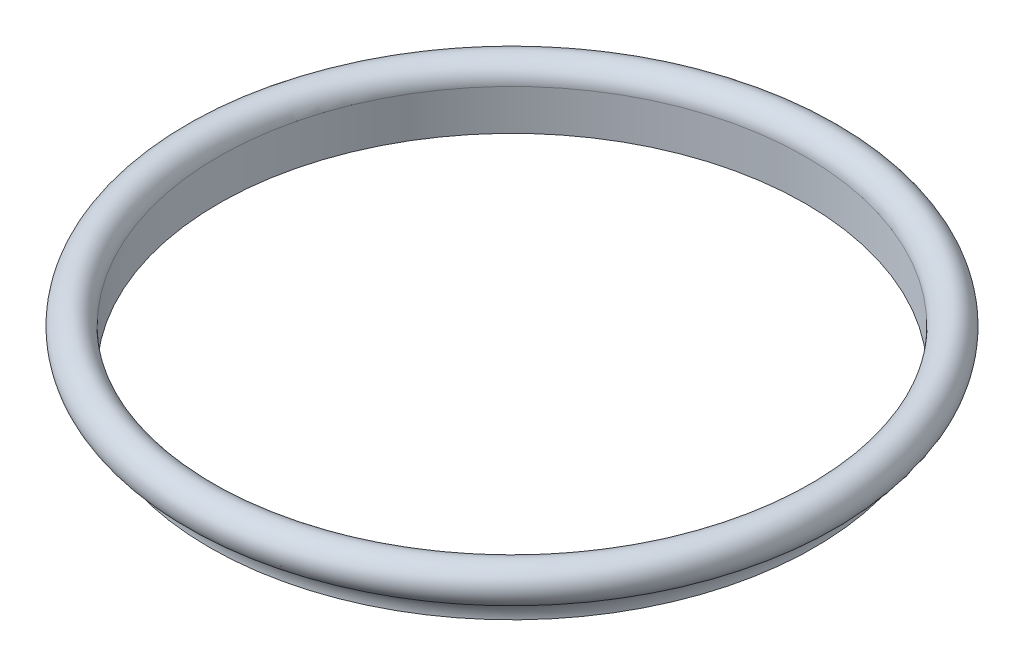
ISO-10303-21;
HEADER;
FILE_DESCRIPTION(('STEP AP214'),'2;1');
FILE_NAME('part.step','',(''),(''),'','','');
FILE_SCHEMA(('AUTOMOTIVE_DESIGN { 1 0 10303 214 1 1 1 1 }'));
ENDSEC;
DATA;
#1=APPLICATION_CONTEXT('core data for automotive mechanical design processes');
#2=APPLICATION_PROTOCOL_DEFINITION('international standard','automotive_design',2000,#1);
#3=PRODUCT_CONTEXT('',#1,'mechanical');
#4=PRODUCT('Part','Part','',(#3));
#5=PRODUCT_RELATED_PRODUCT_CATEGORY('part','',(#4));
#6=PRODUCT_DEFINITION_FORMATION('','',#4);
#7=PRODUCT_DEFINITION_CONTEXT('part definition',#1,'design');
#8=PRODUCT_DEFINITION('design','',#6,#7);
#9=PRODUCT_DEFINITION_SHAPE('','',#8);
#10=(LENGTH_UNIT() NAMED_UNIT(*) SI_UNIT(.MILLI.,.METRE.));
#11=(NAMED_UNIT(*) PLANE_ANGLE_UNIT() SI_UNIT($,.RADIAN.));
#12=(NAMED_UNIT(*) SI_UNIT($,.STERADIAN.) SOLID_ANGLE_UNIT());
#13=UNCERTAINTY_MEASURE_WITH_UNIT(LENGTH_MEASURE(1.E-05),#10,'distance_accuracy_value','');
#14=(GEOMETRIC_REPRESENTATION_CONTEXT(3) GLOBAL_UNCERTAINTY_ASSIGNED_CONTEXT((#13)) GLOBAL_UNIT_ASSIGNED_CONTEXT((#10,
#11,#12)) REPRESENTATION_CONTEXT('',''));
#15=CARTESIAN_POINT('',(0.,0.,0.));
#16=DIRECTION('',(0.,0.,1.));
#17=DIRECTION('',(1.,0.,0.));
#18=AXIS2_PLACEMENT_3D('',#15,#16,#17);
#19=CARTESIAN_POINT('',(85.09,0.,0.));
#20=DIRECTION('',(0.,-1.,0.));
#21=DIRECTION('',(0.,0.,-1.));
#22=AXIS2_PLACEMENT_3D('',#19,#20,#21);
#23=PLANE('',#22);
#24=CARTESIAN_POINT('',(0.,0.,0.));
#25=DIRECTION('',(0.,-1.,0.));
#26=DIRECTION('',(0.,0.,-1.));
#27=AXIS2_PLACEMENT_3D('',#24,#25,#26);
#28=CIRCLE('',#27,85.09);
#29=CARTESIAN_POINT('',(0.,0.,-85.09));
#30=VERTEX_POINT('',#29);
#31=EDGE_CURVE('E44',#30,#30,#28,.T.);
#32=ORIENTED_EDGE('',*,*,#31,.T.);
#33=EDGE_LOOP('',(#32));
#34=FACE_BOUND('',#33,.T.);
#35=CARTESIAN_POINT('',(0.,0.,0.));
#36=DIRECTION('',(0.,-1.,0.));
#37=DIRECTION('',(0.,0.,-1.));
#38=AXIS2_PLACEMENT_3D('',#35,#36,#37);
#39=CIRCLE('',#38,82.55);
#40=CARTESIAN_POINT('',(0.,0.,-82.55));
#41=VERTEX_POINT('',#40);
#42=EDGE_CURVE('E10',#41,#41,#39,.T.);
#43=ORIENTED_EDGE('',*,*,#42,.F.);
#44=EDGE_LOOP('',(#43));
#45=FACE_BOUND('',#44,.T.);
#46=ADVANCED_FACE('F30',(#34,#45),#23,.T.);
#47=CARTESIAN_POINT('',(0.,0.,0.));
#48=DIRECTION('',(0.,-1.,0.));
#49=DIRECTION('',(0.,0.,-1.));
#50=AXIS2_PLACEMENT_3D('',#47,#48,#49);
#51=CYLINDRICAL_SURFACE('',#50,82.55);
#52=ORIENTED_EDGE('',*,*,#42,.T.);
#53=EDGE_LOOP('',(#52));
#54=FACE_BOUND('',#53,.T.);
#55=CARTESIAN_POINT('',(0.,11.43,0.));
#56=DIRECTION('',(0.,-1.,0.));
#57=DIRECTION('',(0.,0.,-1.));
#58=AXIS2_PLACEMENT_3D('',#55,#56,#57);
#59=CIRCLE('',#58,82.55);
#60=CARTESIAN_POINT('',(0.,11.43,-82.55));
#61=VERTEX_POINT('',#60);
#62=EDGE_CURVE('E36',#61,#61,#59,.T.);
#63=ORIENTED_EDGE('',*,*,#62,.F.);
#64=EDGE_LOOP('',(#63));
#65=FACE_BOUND('',#64,.T.);
#66=ADVANCED_FACE('F60',(#54,#65),#51,.F.);
#67=CARTESIAN_POINT('',(0.,11.43,0.));
#68=DIRECTION('',(0.,-1.,0.));
#69=DIRECTION('',(0.,0.,-1.));
#70=AXIS2_PLACEMENT_3D('',#67,#68,#69);
#71=TOROIDAL_SURFACE('',#70,87.63,5.08);
#72=ORIENTED_EDGE('',*,*,#62,.T.);
#73=EDGE_LOOP('',(#72));
#74=FACE_BOUND('',#73,.T.);
#75=CARTESIAN_POINT('',(0.,7.40050141494725,0.));
#76=DIRECTION('',(0.,-1.,0.));
#77=DIRECTION('',(0.,0.,-1.));
#78=AXIS2_PLACEMENT_3D('',#75,#76,#77);
#79=CIRCLE('',#78,90.7234674966868);
#80=CARTESIAN_POINT('',(0.,7.40050141494725,-90.7234674966868));
#81=VERTEX_POINT('',#80);
#82=EDGE_CURVE('E40',#81,#81,#79,.T.);
#83=ORIENTED_EDGE('',*,*,#82,.F.);
#84=EDGE_LOOP('',(#83));
#85=FACE_BOUND('',#84,.T.);
#86=ADVANCED_FACE('F54',(#74,#85),#71,.T.);
#87=CARTESIAN_POINT('',(0.,0.543362772293055,0.));
#88=DIRECTION('',(0.,-1.,0.));
#89=DIRECTION('',(0.,0.,-1.));
#90=AXIS2_PLACEMENT_3D('',#87,#88,#89);
#91=TOROIDAL_SURFACE('',#90,92.0538338505227,6.985);
#92=ORIENTED_EDGE('',*,*,#82,.T.);
#93=EDGE_LOOP('',(#92));
#94=FACE_BOUND('',#93,.T.);
#95=ORIENTED_EDGE('',*,*,#31,.F.);
#96=EDGE_LOOP('',(#95));
#97=FACE_BOUND('',#96,.T.);
#98=ADVANCED_FACE('F52',(#94,#97),#91,.F.);
#99=CLOSED_SHELL('',(#46,#66,#86,#98));
#100=MANIFOLD_SOLID_BREP('B2',#99);
#101=ADVANCED_BREP_SHAPE_REPRESENTATION('',(#18,#100),#14);
#102=SHAPE_DEFINITION_REPRESENTATION(#9,#101);
ENDSEC;
END-ISO-10303-21;
